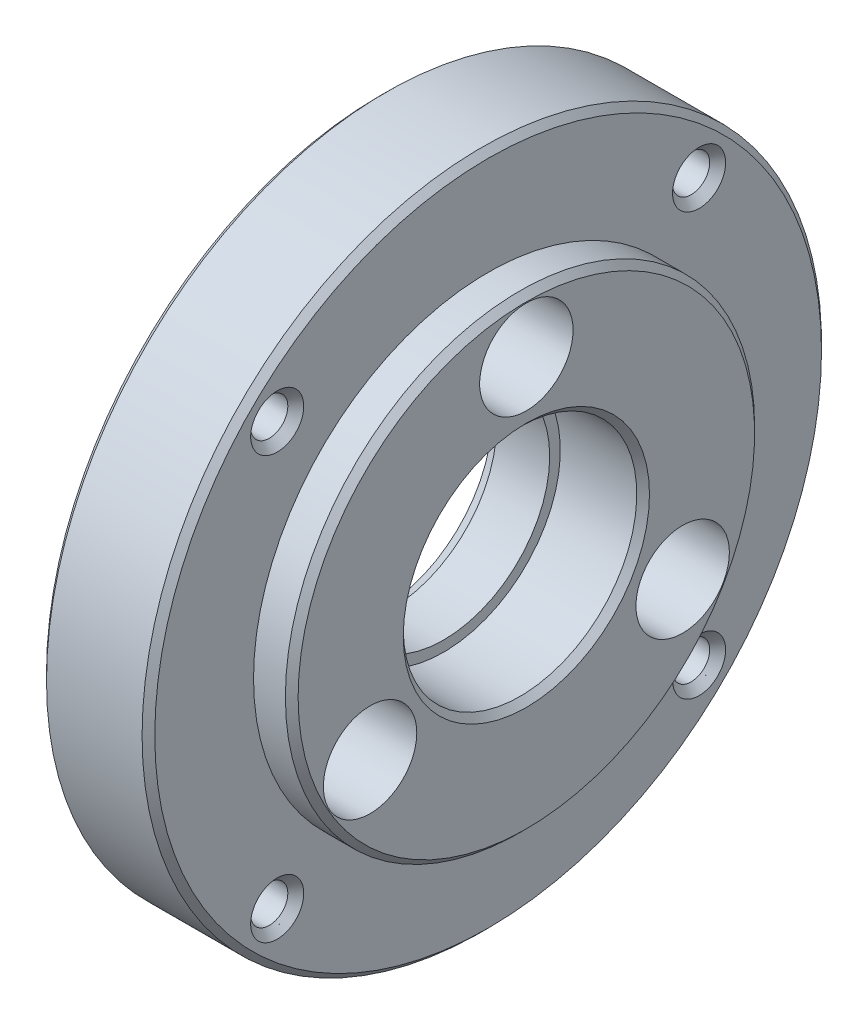
ISO-10303-21;
HEADER;
FILE_DESCRIPTION(('STEP AP214'),'2;1');
FILE_NAME('part.step','',(''),(''),'','','');
FILE_SCHEMA(('AUTOMOTIVE_DESIGN { 1 0 10303 214 1 1 1 1 }'));
ENDSEC;
DATA;
#1=APPLICATION_CONTEXT('core data for automotive mechanical design processes');
#2=APPLICATION_PROTOCOL_DEFINITION('international standard','automotive_design',2000,#1);
#3=PRODUCT_CONTEXT('',#1,'mechanical');
#4=PRODUCT('Part','Part','',(#3));
#5=PRODUCT_RELATED_PRODUCT_CATEGORY('part','',(#4));
#6=PRODUCT_DEFINITION_FORMATION('','',#4);
#7=PRODUCT_DEFINITION_CONTEXT('part definition',#1,'design');
#8=PRODUCT_DEFINITION('design','',#6,#7);
#9=PRODUCT_DEFINITION_SHAPE('','',#8);
#10=(LENGTH_UNIT() NAMED_UNIT(*) SI_UNIT(.MILLI.,.METRE.));
#11=(NAMED_UNIT(*) PLANE_ANGLE_UNIT() SI_UNIT($,.RADIAN.));
#12=(NAMED_UNIT(*) SI_UNIT($,.STERADIAN.) SOLID_ANGLE_UNIT());
#13=UNCERTAINTY_MEASURE_WITH_UNIT(LENGTH_MEASURE(1.E-05),#10,'distance_accuracy_value','');
#14=(GEOMETRIC_REPRESENTATION_CONTEXT(3) GLOBAL_UNCERTAINTY_ASSIGNED_CONTEXT((#13)) GLOBAL_UNIT_ASSIGNED_CONTEXT((#10,
#11,#12)) REPRESENTATION_CONTEXT('',''));
#15=CARTESIAN_POINT('',(0.,0.,0.));
#16=DIRECTION('',(0.,0.,1.));
#17=DIRECTION('',(1.,0.,0.));
#18=AXIS2_PLACEMENT_3D('',#15,#16,#17);
#19=CARTESIAN_POINT('',(1.80000000000291,0.,0.));
#20=DIRECTION('',(1.,0.,0.));
#21=DIRECTION('',(0.,1.,0.));
#22=AXIS2_PLACEMENT_3D('',#19,#20,#21);
#23=CONICAL_SURFACE('',#22,5.79900000002453,0.78539816358756);
#24=CARTESIAN_POINT('',(1.501,0.,0.));
#25=DIRECTION('',(-1.,0.,0.));
#26=DIRECTION('',(0.,0.,1.));
#27=AXIS2_PLACEMENT_3D('',#24,#25,#26);
#28=CIRCLE('',#27,5.5);
#29=CARTESIAN_POINT('',(1.501,0.,5.5));
#30=VERTEX_POINT('',#29);
#31=EDGE_CURVE('P0_E113',#30,#30,#28,.T.);
#32=ORIENTED_EDGE('',*,*,#31,.T.);
#33=EDGE_LOOP('',(#32));
#34=FACE_BOUND('',#33,.T.);
#35=CARTESIAN_POINT('',(1.80000000000291,0.,0.));
#36=DIRECTION('',(1.,0.,0.));
#37=DIRECTION('',(0.,1.,0.));
#38=AXIS2_PLACEMENT_3D('',#35,#36,#37);
#39=CIRCLE('',#38,5.79900000002453);
#40=CARTESIAN_POINT('',(1.80000000000291,5.79900000002453,0.));
#41=VERTEX_POINT('',#40);
#42=EDGE_CURVE('P0_E18',#41,#41,#39,.T.);
#43=ORIENTED_EDGE('',*,*,#42,.T.);
#44=EDGE_LOOP('',(#43));
#45=FACE_BOUND('',#44,.T.);
#46=ADVANCED_FACE('P0_F15',(#34,#45),#23,.F.);
#47=CARTESIAN_POINT('',(1.49999999999798,0.,0.));
#48=DIRECTION('',(-1.,0.,0.));
#49=DIRECTION('',(0.,0.,1.));
#50=AXIS2_PLACEMENT_3D('',#47,#48,#49);
#51=CONICAL_SURFACE('',#50,11.049999999998,0.785398163397301);
#52=CARTESIAN_POINT('',(1.49999999999798,0.,0.));
#53=DIRECTION('',(-1.,0.,0.));
#54=DIRECTION('',(0.,0.,1.));
#55=AXIS2_PLACEMENT_3D('',#52,#53,#54);
#56=CIRCLE('',#55,11.05);
#57=CARTESIAN_POINT('',(1.49999999999798,0.,11.05));
#58=VERTEX_POINT('',#57);
#59=EDGE_CURVE('P0_E30',#58,#58,#56,.T.);
#60=ORIENTED_EDGE('',*,*,#59,.F.);
#61=EDGE_LOOP('',(#60));
#62=FACE_BOUND('',#61,.T.);
#63=CARTESIAN_POINT('',(1.79999999999801,0.,0.));
#64=DIRECTION('',(-1.,0.,0.));
#65=DIRECTION('',(0.,0.,1.));
#66=AXIS2_PLACEMENT_3D('',#63,#64,#65);
#67=CIRCLE('',#66,10.749999999998);
#68=CARTESIAN_POINT('',(1.79999999999801,0.,10.749999999998));
#69=VERTEX_POINT('',#68);
#70=EDGE_CURVE('P0_E108',#69,#69,#67,.T.);
#71=ORIENTED_EDGE('',*,*,#70,.T.);
#72=EDGE_LOOP('',(#71));
#73=FACE_BOUND('',#72,.T.);
#74=ADVANCED_FACE('P0_F428',(#62,#73),#51,.T.);
#75=CARTESIAN_POINT('',(2.145,0.,0.));
#76=DIRECTION('',(-1.,0.,0.));
#77=DIRECTION('',(0.,0.,1.));
#78=AXIS2_PLACEMENT_3D('',#75,#76,#77);
#79=CYLINDRICAL_SURFACE('',#78,11.05);
#80=ORIENTED_EDGE('',*,*,#59,.T.);
#81=EDGE_LOOP('',(#80));
#82=FACE_BOUND('',#81,.T.);
#83=CARTESIAN_POINT('',(0.,0.,0.));
#84=DIRECTION('',(-1.,0.,0.));
#85=DIRECTION('',(0.,0.,1.));
#86=AXIS2_PLACEMENT_3D('',#83,#84,#85);
#87=CIRCLE('',#86,11.05);
#88=CARTESIAN_POINT('',(0.,0.,11.05));
#89=VERTEX_POINT('',#88);
#90=EDGE_CURVE('P0_E106',#89,#89,#87,.F.);
#91=ORIENTED_EDGE('',*,*,#90,.T.);
#92=EDGE_LOOP('',(#91));
#93=FACE_BOUND('',#92,.T.);
#94=ADVANCED_FACE('P0_F420',(#82,#93),#79,.T.);
#95=CARTESIAN_POINT('',(2.145,0.,0.));
#96=DIRECTION('',(-1.,0.,0.));
#97=DIRECTION('',(0.,0.,1.));
#98=AXIS2_PLACEMENT_3D('',#95,#96,#97);
#99=CYLINDRICAL_SURFACE('',#98,5.5);
#100=ORIENTED_EDGE('',*,*,#31,.F.);
#101=EDGE_LOOP('',(#100));
#102=FACE_BOUND('',#101,.T.);
#103=CARTESIAN_POINT('',(-2.1,0.,0.));
#104=DIRECTION('',(-1.,0.,0.));
#105=DIRECTION('',(0.,0.,1.));
#106=AXIS2_PLACEMENT_3D('',#103,#104,#105);
#107=CIRCLE('',#106,5.5);
#108=CARTESIAN_POINT('',(-2.1,0.,5.5));
#109=VERTEX_POINT('',#108);
#110=EDGE_CURVE('P0_E100',#109,#109,#107,.T.);
#111=ORIENTED_EDGE('',*,*,#110,.T.);
#112=EDGE_LOOP('',(#111));
#113=FACE_BOUND('',#112,.T.);
#114=ADVANCED_FACE('P0_F412',(#102,#113),#99,.F.);
#115=CARTESIAN_POINT('',(1.8,0.,0.));
#116=DIRECTION('',(-1.,0.,0.));
#117=DIRECTION('',(0.,0.,1.));
#118=AXIS2_PLACEMENT_3D('',#115,#116,#117);
#119=PLANE('',#118);
#120=ORIENTED_EDGE('',*,*,#70,.F.);
#121=EDGE_LOOP('',(#120));
#122=FACE_BOUND('',#121,.T.);
#123=CARTESIAN_POINT('',(1.8,8.5,0.));
#124=DIRECTION('',(1.,0.,0.));
#125=DIRECTION('',(0.,0.,-1.));
#126=AXIS2_PLACEMENT_3D('',#123,#124,#125);
#127=CIRCLE('',#126,2.2);
#128=CARTESIAN_POINT('',(1.8,8.5,-2.2));
#129=VERTEX_POINT('',#128);
#130=EDGE_CURVE('P0_E94',#129,#129,#127,.F.);
#131=ORIENTED_EDGE('',*,*,#130,.T.);
#132=EDGE_LOOP('',(#131));
#133=FACE_BOUND('',#132,.T.);
#134=CARTESIAN_POINT('',(1.8,-4.25,-7.361215932168));
#135=DIRECTION('',(1.,0.,0.));
#136=DIRECTION('',(0.,0.,-1.));
#137=AXIS2_PLACEMENT_3D('',#134,#135,#136);
#138=CIRCLE('',#137,2.2);
#139=CARTESIAN_POINT('',(1.8,-4.25,-9.561215932168));
#140=VERTEX_POINT('',#139);
#141=EDGE_CURVE('P0_E97',#140,#140,#138,.F.);
#142=ORIENTED_EDGE('',*,*,#141,.T.);
#143=EDGE_LOOP('',(#142));
#144=FACE_BOUND('',#143,.T.);
#145=CARTESIAN_POINT('',(1.8,-4.25,7.361215932168));
#146=DIRECTION('',(1.,0.,0.));
#147=DIRECTION('',(0.,0.,-1.));
#148=AXIS2_PLACEMENT_3D('',#145,#146,#147);
#149=CIRCLE('',#148,2.2);
#150=CARTESIAN_POINT('',(1.8,-4.25,5.161215932168));
#151=VERTEX_POINT('',#150);
#152=EDGE_CURVE('P0_E103',#151,#151,#149,.F.);
#153=ORIENTED_EDGE('',*,*,#152,.T.);
#154=EDGE_LOOP('',(#153));
#155=FACE_BOUND('',#154,.T.);
#156=ORIENTED_EDGE('',*,*,#42,.F.);
#157=EDGE_LOOP('',(#156));
#158=FACE_BOUND('',#157,.T.);
#159=ADVANCED_FACE('P0_F173',(#122,#133,#144,#155,#158),#119,.F.);
#160=CARTESIAN_POINT('',(0.,0.,0.));
#161=DIRECTION('',(-1.,0.,0.));
#162=DIRECTION('',(0.,0.,1.));
#163=AXIS2_PLACEMENT_3D('',#160,#161,#162);
#164=PLANE('',#163);
#165=CARTESIAN_POINT('',(-4.85722573273506E-13,0.,0.));
#166=DIRECTION('',(-1.,0.,0.));
#167=DIRECTION('',(0.,0.,1.));
#168=AXIS2_PLACEMENT_3D('',#165,#166,#167);
#169=CIRCLE('',#168,15.7009999999995);
#170=CARTESIAN_POINT('',(-4.85722573273506E-13,0.,15.7009999999995));
#171=VERTEX_POINT('',#170);
#172=EDGE_CURVE('P0_E79',#171,#171,#169,.T.);
#173=ORIENTED_EDGE('',*,*,#172,.F.);
#174=EDGE_LOOP('',(#173));
#175=FACE_BOUND('',#174,.T.);
#176=ORIENTED_EDGE('',*,*,#90,.F.);
#177=EDGE_LOOP('',(#176));
#178=FACE_BOUND('',#177,.T.);
#179=CARTESIAN_POINT('',(-5.6843418860808E-11,9.934850275671,9.934850275671));
#180=DIRECTION('',(1.,0.,0.));
#181=DIRECTION('',(0.,0.,-1.));
#182=AXIS2_PLACEMENT_3D('',#179,#180,#181);
#183=CIRCLE('',#182,1.24999999997168);
#184=CARTESIAN_POINT('',(-5.6843418860808E-11,9.934850275671,8.68485027569932));
#185=VERTEX_POINT('',#184);
#186=EDGE_CURVE('P0_E82',#185,#185,#183,.F.);
#187=ORIENTED_EDGE('',*,*,#186,.T.);
#188=EDGE_LOOP('',(#187));
#189=FACE_BOUND('',#188,.T.);
#190=CARTESIAN_POINT('',(0.,9.934850275671,-9.934850275671));
#191=DIRECTION('',(1.,0.,0.));
#192=DIRECTION('',(0.,0.,-1.));
#193=AXIS2_PLACEMENT_3D('',#190,#191,#192);
#194=CIRCLE('',#193,1.2499999999692);
#195=CARTESIAN_POINT('',(0.,9.934850275671,-11.1848502756402));
#196=VERTEX_POINT('',#195);
#197=EDGE_CURVE('P0_E85',#196,#196,#194,.F.);
#198=ORIENTED_EDGE('',*,*,#197,.T.);
#199=EDGE_LOOP('',(#198));
#200=FACE_BOUND('',#199,.T.);
#201=CARTESIAN_POINT('',(0.,-9.934850275671,-9.934850275671));
#202=DIRECTION('',(1.,0.,0.));
#203=DIRECTION('',(0.,0.,-1.));
#204=AXIS2_PLACEMENT_3D('',#201,#202,#203);
#205=CIRCLE('',#204,1.2499999999692);
#206=CARTESIAN_POINT('',(0.,-9.934850275671,-11.1848502756402));
#207=VERTEX_POINT('',#206);
#208=EDGE_CURVE('P0_E88',#207,#207,#205,.F.);
#209=ORIENTED_EDGE('',*,*,#208,.T.);
#210=EDGE_LOOP('',(#209));
#211=FACE_BOUND('',#210,.T.);
#212=CARTESIAN_POINT('',(-5.6843418860808E-11,-9.934850275671,9.934850275671));
#213=DIRECTION('',(1.,0.,0.));
#214=DIRECTION('',(0.,0.,-1.));
#215=AXIS2_PLACEMENT_3D('',#212,#213,#214);
#216=CIRCLE('',#215,1.24999999997168);
#217=CARTESIAN_POINT('',(-5.6843418860808E-11,-9.934850275671,8.68485027569932));
#218=VERTEX_POINT('',#217);
#219=EDGE_CURVE('P0_E91',#218,#218,#216,.F.);
#220=ORIENTED_EDGE('',*,*,#219,.T.);
#221=EDGE_LOOP('',(#220));
#222=FACE_BOUND('',#221,.T.);
#223=ADVANCED_FACE('P0_F169',(#175,#178,#189,#200,#211,#222),#164,.F.);
#224=CARTESIAN_POINT('',(-2.6,-4.25,7.361215932168));
#225=DIRECTION('',(1.,0.,0.));
#226=DIRECTION('',(0.,0.,-1.));
#227=AXIS2_PLACEMENT_3D('',#224,#225,#226);
#228=CYLINDRICAL_SURFACE('',#227,2.2);
#229=ORIENTED_EDGE('',*,*,#152,.F.);
#230=EDGE_LOOP('',(#229));
#231=FACE_BOUND('',#230,.T.);
#232=CARTESIAN_POINT('',(-2.6,-4.25,7.361215932168));
#233=DIRECTION('',(1.,0.,0.));
#234=DIRECTION('',(0.,0.,-1.));
#235=AXIS2_PLACEMENT_3D('',#232,#233,#234);
#236=CIRCLE('',#235,2.2);
#237=CARTESIAN_POINT('',(-2.6,-4.25,5.161215932168));
#238=VERTEX_POINT('',#237);
#239=EDGE_CURVE('P0_E76',#238,#238,#236,.T.);
#240=ORIENTED_EDGE('',*,*,#239,.F.);
#241=EDGE_LOOP('',(#240));
#242=FACE_BOUND('',#241,.T.);
#243=ADVANCED_FACE('P0_F172',(#231,#242),#228,.F.);
#244=CARTESIAN_POINT('',(-2.1,0.,0.));
#245=DIRECTION('',(-1.,0.,0.));
#246=DIRECTION('',(0.,0.,1.));
#247=AXIS2_PLACEMENT_3D('',#244,#245,#246);
#248=PLANE('',#247);
#249=ORIENTED_EDGE('',*,*,#110,.F.);
#250=EDGE_LOOP('',(#249));
#251=FACE_BOUND('',#250,.T.);
#252=CARTESIAN_POINT('',(-2.1,0.,0.));
#253=DIRECTION('',(-1.,0.,0.));
#254=DIRECTION('',(0.,0.,1.));
#255=AXIS2_PLACEMENT_3D('',#252,#253,#254);
#256=CIRCLE('',#255,5.);
#257=CARTESIAN_POINT('',(-2.1,0.,5.));
#258=VERTEX_POINT('',#257);
#259=EDGE_CURVE('P0_E73',#258,#258,#256,.T.);
#260=ORIENTED_EDGE('',*,*,#259,.T.);
#261=EDGE_LOOP('',(#260));
#262=FACE_BOUND('',#261,.T.);
#263=ADVANCED_FACE('P0_F386',(#251,#262),#248,.F.);
#264=CARTESIAN_POINT('',(-2.6,-4.25,-7.361215932168));
#265=DIRECTION('',(1.,0.,0.));
#266=DIRECTION('',(0.,0.,-1.));
#267=AXIS2_PLACEMENT_3D('',#264,#265,#266);
#268=CYLINDRICAL_SURFACE('',#267,2.2);
#269=ORIENTED_EDGE('',*,*,#141,.F.);
#270=EDGE_LOOP('',(#269));
#271=FACE_BOUND('',#270,.T.);
#272=CARTESIAN_POINT('',(-2.6,-4.25,-7.361215932168));
#273=DIRECTION('',(1.,0.,0.));
#274=DIRECTION('',(0.,0.,-1.));
#275=AXIS2_PLACEMENT_3D('',#272,#273,#274);
#276=CIRCLE('',#275,2.2);
#277=CARTESIAN_POINT('',(-2.6,-4.25,-9.561215932168));
#278=VERTEX_POINT('',#277);
#279=EDGE_CURVE('P0_E70',#278,#278,#276,.T.);
#280=ORIENTED_EDGE('',*,*,#279,.F.);
#281=EDGE_LOOP('',(#280));
#282=FACE_BOUND('',#281,.T.);
#283=ADVANCED_FACE('P0_F199',(#271,#282),#268,.F.);
#284=CARTESIAN_POINT('',(-2.6,8.5,0.));
#285=DIRECTION('',(1.,0.,0.));
#286=DIRECTION('',(0.,0.,-1.));
#287=AXIS2_PLACEMENT_3D('',#284,#285,#286);
#288=CYLINDRICAL_SURFACE('',#287,2.2);
#289=ORIENTED_EDGE('',*,*,#130,.F.);
#290=EDGE_LOOP('',(#289));
#291=FACE_BOUND('',#290,.T.);
#292=CARTESIAN_POINT('',(-2.6,8.5,0.));
#293=DIRECTION('',(1.,0.,0.));
#294=DIRECTION('',(0.,0.,-1.));
#295=AXIS2_PLACEMENT_3D('',#292,#293,#294);
#296=CIRCLE('',#295,2.2);
#297=CARTESIAN_POINT('',(-2.6,8.5,-2.2));
#298=VERTEX_POINT('',#297);
#299=EDGE_CURVE('P0_E66',#298,#298,#296,.T.);
#300=ORIENTED_EDGE('',*,*,#299,.F.);
#301=EDGE_LOOP('',(#300));
#302=FACE_BOUND('',#301,.T.);
#303=ADVANCED_FACE('P0_F188',(#291,#302),#288,.F.);
#304=CARTESIAN_POINT('',(-5.6843418860808E-11,-9.934850275671,9.934850275671));
#305=DIRECTION('',(1.,0.,0.));
#306=DIRECTION('',(0.,0.,-1.));
#307=AXIS2_PLACEMENT_3D('',#304,#305,#306);
#308=CONICAL_SURFACE('',#307,1.24999999997168,0.785398163549031);
#309=CARTESIAN_POINT('',(-0.375,-9.934850275671,9.934850275671));
#310=DIRECTION('',(1.,0.,0.));
#311=DIRECTION('',(0.,0.,-1.));
#312=AXIS2_PLACEMENT_3D('',#309,#310,#311);
#313=CIRCLE('',#312,0.875000000000001);
#314=CARTESIAN_POINT('',(-0.375,-9.934850275671,9.059850275671));
#315=VERTEX_POINT('',#314);
#316=EDGE_CURVE('P0_E69',#315,#315,#313,.F.);
#317=ORIENTED_EDGE('',*,*,#316,.T.);
#318=EDGE_LOOP('',(#317));
#319=FACE_BOUND('',#318,.T.);
#320=ORIENTED_EDGE('',*,*,#219,.F.);
#321=EDGE_LOOP('',(#320));
#322=FACE_BOUND('',#321,.T.);
#323=ADVANCED_FACE('P0_F185',(#319,#322),#308,.F.);
#324=CARTESIAN_POINT('',(0.,-9.934850275671,-9.934850275671));
#325=DIRECTION('',(1.,0.,0.));
#326=DIRECTION('',(0.,0.,-1.));
#327=AXIS2_PLACEMENT_3D('',#324,#325,#326);
#328=CONICAL_SURFACE('',#327,1.2499999999692,0.785398163397448);
#329=CARTESIAN_POINT('',(-0.375,-9.934850275671,-9.934850275671));
#330=DIRECTION('',(1.,0.,0.));
#331=DIRECTION('',(0.,0.,-1.));
#332=AXIS2_PLACEMENT_3D('',#329,#330,#331);
#333=CIRCLE('',#332,0.875000000000001);
#334=CARTESIAN_POINT('',(-0.375,-9.934850275671,-10.809850275671));
#335=VERTEX_POINT('',#334);
#336=EDGE_CURVE('P0_E123',#335,#335,#333,.F.);
#337=ORIENTED_EDGE('',*,*,#336,.T.);
#338=EDGE_LOOP('',(#337));
#339=FACE_BOUND('',#338,.T.);
#340=ORIENTED_EDGE('',*,*,#208,.F.);
#341=EDGE_LOOP('',(#340));
#342=FACE_BOUND('',#341,.T.);
#343=ADVANCED_FACE('P0_F187',(#339,#342),#328,.F.);
#344=CARTESIAN_POINT('',(0.,9.934850275671,-9.934850275671));
#345=DIRECTION('',(1.,0.,0.));
#346=DIRECTION('',(0.,0.,-1.));
#347=AXIS2_PLACEMENT_3D('',#344,#345,#346);
#348=CONICAL_SURFACE('',#347,1.2499999999692,0.785398163397448);
#349=CARTESIAN_POINT('',(-0.375,9.934850275671,-9.934850275671));
#350=DIRECTION('',(1.,0.,0.));
#351=DIRECTION('',(0.,0.,-1.));
#352=AXIS2_PLACEMENT_3D('',#349,#350,#351);
#353=CIRCLE('',#352,0.875000000000001);
#354=CARTESIAN_POINT('',(-0.375,9.934850275671,-10.809850275671));
#355=VERTEX_POINT('',#354);
#356=EDGE_CURVE('P0_E126',#355,#355,#353,.F.);
#357=ORIENTED_EDGE('',*,*,#356,.T.);
#358=EDGE_LOOP('',(#357));
#359=FACE_BOUND('',#358,.T.);
#360=ORIENTED_EDGE('',*,*,#197,.F.);
#361=EDGE_LOOP('',(#360));
#362=FACE_BOUND('',#361,.T.);
#363=ADVANCED_FACE('P0_F196',(#359,#362),#348,.F.);
#364=CARTESIAN_POINT('',(-5.6843418860808E-11,9.934850275671,9.934850275671));
#365=DIRECTION('',(1.,0.,0.));
#366=DIRECTION('',(0.,0.,-1.));
#367=AXIS2_PLACEMENT_3D('',#364,#365,#366);
#368=CONICAL_SURFACE('',#367,1.24999999997168,0.785398163549031);
#369=CARTESIAN_POINT('',(-0.375,9.934850275671,9.934850275671));
#370=DIRECTION('',(1.,0.,0.));
#371=DIRECTION('',(0.,0.,-1.));
#372=AXIS2_PLACEMENT_3D('',#369,#370,#371);
#373=CIRCLE('',#372,0.875000000000001);
#374=CARTESIAN_POINT('',(-0.375,9.934850275671,9.059850275671));
#375=VERTEX_POINT('',#374);
#376=EDGE_CURVE('P0_E129',#375,#375,#373,.F.);
#377=ORIENTED_EDGE('',*,*,#376,.T.);
#378=EDGE_LOOP('',(#377));
#379=FACE_BOUND('',#378,.T.);
#380=ORIENTED_EDGE('',*,*,#186,.F.);
#381=EDGE_LOOP('',(#380));
#382=FACE_BOUND('',#381,.T.);
#383=ADVANCED_FACE('P0_F165',(#379,#382),#368,.F.);
#384=CARTESIAN_POINT('',(-0.298999999972599,0.,0.));
#385=DIRECTION('',(-1.,0.,0.));
#386=DIRECTION('',(0.,0.,1.));
#387=AXIS2_PLACEMENT_3D('',#384,#385,#386);
#388=CONICAL_SURFACE('',#387,15.9999999999716,0.785398163397301);
#389=CARTESIAN_POINT('',(-0.2989999999726,0.,0.));
#390=DIRECTION('',(-1.,0.,0.));
#391=DIRECTION('',(0.,0.,1.));
#392=AXIS2_PLACEMENT_3D('',#389,#390,#391);
#393=CIRCLE('',#392,16.);
#394=CARTESIAN_POINT('',(-0.2989999999726,0.,16.));
#395=VERTEX_POINT('',#394);
#396=EDGE_CURVE('P0_E65',#395,#395,#393,.T.);
#397=ORIENTED_EDGE('',*,*,#396,.F.);
#398=EDGE_LOOP('',(#397));
#399=FACE_BOUND('',#398,.T.);
#400=ORIENTED_EDGE('',*,*,#172,.T.);
#401=EDGE_LOOP('',(#400));
#402=FACE_BOUND('',#401,.T.);
#403=ADVANCED_FACE('P0_F161',(#399,#402),#388,.T.);
#404=CARTESIAN_POINT('',(-2.6,-4.25,7.361215932168));
#405=DIRECTION('',(1.,0.,0.));
#406=DIRECTION('',(0.,0.,-1.));
#407=AXIS2_PLACEMENT_3D('',#404,#405,#406);
#408=PLANE('',#407);
#409=ORIENTED_EDGE('',*,*,#239,.T.);
#410=EDGE_LOOP('',(#409));
#411=FACE_BOUND('',#410,.T.);
#412=CARTESIAN_POINT('',(-2.6,-4.25,7.361215932168));
#413=DIRECTION('',(1.,0.,0.));
#414=DIRECTION('',(0.,0.,-1.));
#415=AXIS2_PLACEMENT_3D('',#412,#413,#414);
#416=CIRCLE('',#415,1.2);
#417=CARTESIAN_POINT('',(-2.6,-4.25,6.161215932168));
#418=VERTEX_POINT('',#417);
#419=EDGE_CURVE('P0_E62',#418,#418,#416,.F.);
#420=ORIENTED_EDGE('',*,*,#419,.T.);
#421=EDGE_LOOP('',(#420));
#422=FACE_BOUND('',#421,.T.);
#423=ADVANCED_FACE('P0_F164',(#411,#422),#408,.T.);
#424=CARTESIAN_POINT('',(2.145,0.,0.));
#425=DIRECTION('',(-1.,0.,0.));
#426=DIRECTION('',(0.,0.,1.));
#427=AXIS2_PLACEMENT_3D('',#424,#425,#426);
#428=CYLINDRICAL_SURFACE('',#427,5.);
#429=ORIENTED_EDGE('',*,*,#259,.F.);
#430=EDGE_LOOP('',(#429));
#431=FACE_BOUND('',#430,.T.);
#432=CARTESIAN_POINT('',(-4.59999999998217,0.,0.));
#433=DIRECTION('',(-1.,0.,0.));
#434=DIRECTION('',(0.,0.,1.));
#435=AXIS2_PLACEMENT_3D('',#432,#433,#434);
#436=CIRCLE('',#435,4.99999999999545);
#437=CARTESIAN_POINT('',(-4.59999999998217,0.,4.99999999999545));
#438=VERTEX_POINT('',#437);
#439=EDGE_CURVE('P0_E61',#438,#438,#436,.T.);
#440=ORIENTED_EDGE('',*,*,#439,.T.);
#441=EDGE_LOOP('',(#440));
#442=FACE_BOUND('',#441,.T.);
#443=ADVANCED_FACE('P0_F264',(#431,#442),#428,.F.);
#444=CARTESIAN_POINT('',(-2.6,-4.25,-7.361215932168));
#445=DIRECTION('',(1.,0.,0.));
#446=DIRECTION('',(0.,0.,-1.));
#447=AXIS2_PLACEMENT_3D('',#444,#445,#446);
#448=PLANE('',#447);
#449=ORIENTED_EDGE('',*,*,#279,.T.);
#450=EDGE_LOOP('',(#449));
#451=FACE_BOUND('',#450,.T.);
#452=CARTESIAN_POINT('',(-2.6,-4.25,-7.361215932168));
#453=DIRECTION('',(1.,0.,0.));
#454=DIRECTION('',(0.,0.,-1.));
#455=AXIS2_PLACEMENT_3D('',#452,#453,#454);
#456=CIRCLE('',#455,1.2);
#457=CARTESIAN_POINT('',(-2.6,-4.25,-8.561215932168));
#458=VERTEX_POINT('',#457);
#459=EDGE_CURVE('P0_E58',#458,#458,#456,.F.);
#460=ORIENTED_EDGE('',*,*,#459,.T.);
#461=EDGE_LOOP('',(#460));
#462=FACE_BOUND('',#461,.T.);
#463=ADVANCED_FACE('P0_F260',(#451,#462),#448,.T.);
#464=CARTESIAN_POINT('',(-2.6,8.5,0.));
#465=DIRECTION('',(1.,0.,0.));
#466=DIRECTION('',(0.,0.,-1.));
#467=AXIS2_PLACEMENT_3D('',#464,#465,#466);
#468=PLANE('',#467);
#469=ORIENTED_EDGE('',*,*,#299,.T.);
#470=EDGE_LOOP('',(#469));
#471=FACE_BOUND('',#470,.T.);
#472=CARTESIAN_POINT('',(-2.6,8.5,0.));
#473=DIRECTION('',(1.,0.,0.));
#474=DIRECTION('',(0.,0.,-1.));
#475=AXIS2_PLACEMENT_3D('',#472,#473,#474);
#476=CIRCLE('',#475,1.2);
#477=CARTESIAN_POINT('',(-2.6,8.5,-1.2));
#478=VERTEX_POINT('',#477);
#479=EDGE_CURVE('P0_E54',#478,#478,#476,.F.);
#480=ORIENTED_EDGE('',*,*,#479,.T.);
#481=EDGE_LOOP('',(#480));
#482=FACE_BOUND('',#481,.T.);
#483=ADVANCED_FACE('P0_F256',(#471,#482),#468,.T.);
#484=CARTESIAN_POINT('',(-5.355,-9.934850275671,9.934850275671));
#485=DIRECTION('',(1.,0.,0.));
#486=DIRECTION('',(0.,0.,-1.));
#487=AXIS2_PLACEMENT_3D('',#484,#485,#486);
#488=CYLINDRICAL_SURFACE('',#487,0.875000000000001);
#489=CARTESIAN_POINT('',(-4.72499999989395,-9.934850275671,9.934850275671));
#490=DIRECTION('',(-1.,0.,0.));
#491=DIRECTION('',(0.,0.,1.));
#492=AXIS2_PLACEMENT_3D('',#489,#490,#491);
#493=CIRCLE('',#492,0.874999999949647);
#494=CARTESIAN_POINT('',(-4.72499999989395,-9.934850275671,10.8098502756206));
#495=VERTEX_POINT('',#494);
#496=EDGE_CURVE('P0_E57',#495,#495,#493,.T.);
#497=ORIENTED_EDGE('',*,*,#496,.T.);
#498=EDGE_LOOP('',(#497));
#499=FACE_BOUND('',#498,.T.);
#500=ORIENTED_EDGE('',*,*,#316,.F.);
#501=EDGE_LOOP('',(#500));
#502=FACE_BOUND('',#501,.T.);
#503=ADVANCED_FACE('P0_F252',(#499,#502),#488,.F.);
#504=CARTESIAN_POINT('',(-5.355,-9.934850275671,-9.934850275671));
#505=DIRECTION('',(1.,0.,0.));
#506=DIRECTION('',(0.,0.,-1.));
#507=AXIS2_PLACEMENT_3D('',#504,#505,#506);
#508=CYLINDRICAL_SURFACE('',#507,0.875000000000001);
#509=CARTESIAN_POINT('',(-4.7249999999508,-9.934850275671,-9.934850275671));
#510=DIRECTION('',(-1.,0.,0.));
#511=DIRECTION('',(0.,0.,1.));
#512=AXIS2_PLACEMENT_3D('',#509,#510,#511);
#513=CIRCLE('',#512,0.875000000008971);
#514=CARTESIAN_POINT('',(-4.7249999999508,-9.934850275671,-9.05985027566203));
#515=VERTEX_POINT('',#514);
#516=EDGE_CURVE('P0_E138',#515,#515,#513,.T.);
#517=ORIENTED_EDGE('',*,*,#516,.T.);
#518=EDGE_LOOP('',(#517));
#519=FACE_BOUND('',#518,.T.);
#520=ORIENTED_EDGE('',*,*,#336,.F.);
#521=EDGE_LOOP('',(#520));
#522=FACE_BOUND('',#521,.T.);
#523=ADVANCED_FACE('P0_F248',(#519,#522),#508,.F.);
#524=CARTESIAN_POINT('',(-5.355,9.934850275671,-9.934850275671));
#525=DIRECTION('',(1.,0.,0.));
#526=DIRECTION('',(0.,0.,-1.));
#527=AXIS2_PLACEMENT_3D('',#524,#525,#526);
#528=CYLINDRICAL_SURFACE('',#527,0.875000000000001);
#529=CARTESIAN_POINT('',(-4.7249999999508,9.934850275671,-9.934850275671));
#530=DIRECTION('',(-1.,0.,0.));
#531=DIRECTION('',(0.,0.,1.));
#532=AXIS2_PLACEMENT_3D('',#529,#530,#531);
#533=CIRCLE('',#532,0.875000000008971);
#534=CARTESIAN_POINT('',(-4.7249999999508,9.934850275671,-9.05985027566203));
#535=VERTEX_POINT('',#534);
#536=EDGE_CURVE('P0_E141',#535,#535,#533,.T.);
#537=ORIENTED_EDGE('',*,*,#536,.T.);
#538=EDGE_LOOP('',(#537));
#539=FACE_BOUND('',#538,.T.);
#540=ORIENTED_EDGE('',*,*,#356,.F.);
#541=EDGE_LOOP('',(#540));
#542=FACE_BOUND('',#541,.T.);
#543=ADVANCED_FACE('P0_F244',(#539,#542),#528,.F.);
#544=CARTESIAN_POINT('',(-5.355,9.934850275671,9.934850275671));
#545=DIRECTION('',(1.,0.,0.));
#546=DIRECTION('',(0.,0.,-1.));
#547=AXIS2_PLACEMENT_3D('',#544,#545,#546);
#548=CYLINDRICAL_SURFACE('',#547,0.875000000000001);
#549=CARTESIAN_POINT('',(-4.72499999989395,9.934850275671,9.934850275671));
#550=DIRECTION('',(-1.,0.,0.));
#551=DIRECTION('',(0.,0.,1.));
#552=AXIS2_PLACEMENT_3D('',#549,#550,#551);
#553=CIRCLE('',#552,0.874999999949647);
#554=CARTESIAN_POINT('',(-4.72499999989395,9.934850275671,10.8098502756206));
#555=VERTEX_POINT('',#554);
#556=EDGE_CURVE('P0_E144',#555,#555,#553,.T.);
#557=ORIENTED_EDGE('',*,*,#556,.T.);
#558=EDGE_LOOP('',(#557));
#559=FACE_BOUND('',#558,.T.);
#560=ORIENTED_EDGE('',*,*,#376,.F.);
#561=EDGE_LOOP('',(#560));
#562=FACE_BOUND('',#561,.T.);
#563=ADVANCED_FACE('P0_F157',(#559,#562),#548,.F.);
#564=CARTESIAN_POINT('',(2.145,0.,0.));
#565=DIRECTION('',(-1.,0.,0.));
#566=DIRECTION('',(0.,0.,1.));
#567=AXIS2_PLACEMENT_3D('',#564,#565,#566);
#568=CYLINDRICAL_SURFACE('',#567,16.);
#569=CARTESIAN_POINT('',(-4.8010000000005,0.,0.));
#570=DIRECTION('',(1.,0.,0.));
#571=DIRECTION('',(0.,0.,-1.));
#572=AXIS2_PLACEMENT_3D('',#569,#570,#571);
#573=CIRCLE('',#572,16.0000000000005);
#574=CARTESIAN_POINT('',(-4.8010000000005,0.,-16.0000000000005));
#575=VERTEX_POINT('',#574);
#576=EDGE_CURVE('P0_E53',#575,#575,#573,.F.);
#577=ORIENTED_EDGE('',*,*,#576,.F.);
#578=EDGE_LOOP('',(#577));
#579=FACE_BOUND('',#578,.T.);
#580=ORIENTED_EDGE('',*,*,#396,.T.);
#581=EDGE_LOOP('',(#580));
#582=FACE_BOUND('',#581,.T.);
#583=ADVANCED_FACE('P0_F153',(#579,#582),#568,.T.);
#584=CARTESIAN_POINT('',(-5.1,-4.25,7.361215932168));
#585=DIRECTION('',(1.,0.,0.));
#586=DIRECTION('',(0.,0.,-1.));
#587=AXIS2_PLACEMENT_3D('',#584,#585,#586);
#588=CYLINDRICAL_SURFACE('',#587,1.2);
#589=ORIENTED_EDGE('',*,*,#419,.F.);
#590=EDGE_LOOP('',(#589));
#591=FACE_BOUND('',#590,.T.);
#592=CARTESIAN_POINT('',(-5.1,-4.25,7.361215932168));
#593=DIRECTION('',(1.,0.,0.));
#594=DIRECTION('',(0.,0.,-1.));
#595=AXIS2_PLACEMENT_3D('',#592,#593,#594);
#596=CIRCLE('',#595,1.2);
#597=CARTESIAN_POINT('',(-5.1,-4.25,6.161215932168));
#598=VERTEX_POINT('',#597);
#599=EDGE_CURVE('P0_E50',#598,#598,#596,.T.);
#600=ORIENTED_EDGE('',*,*,#599,.F.);
#601=EDGE_LOOP('',(#600));
#602=FACE_BOUND('',#601,.T.);
#603=ADVANCED_FACE('P0_F156',(#591,#602),#588,.F.);
#604=CARTESIAN_POINT('',(-5.09999999997035,0.,0.));
#605=DIRECTION('',(-1.,0.,0.));
#606=DIRECTION('',(0.,0.,1.));
#607=AXIS2_PLACEMENT_3D('',#604,#605,#606);
#608=CONICAL_SURFACE('',#607,5.28867513457953,0.523598775592442);
#609=ORIENTED_EDGE('',*,*,#439,.F.);
#610=EDGE_LOOP('',(#609));
#611=FACE_BOUND('',#610,.T.);
#612=CARTESIAN_POINT('',(-5.09999999997035,0.,0.));
#613=DIRECTION('',(-1.,0.,0.));
#614=DIRECTION('',(0.,0.,1.));
#615=AXIS2_PLACEMENT_3D('',#612,#613,#614);
#616=CIRCLE('',#615,5.28867513457953);
#617=CARTESIAN_POINT('',(-5.09999999997035,0.,5.28867513457953));
#618=VERTEX_POINT('',#617);
#619=EDGE_CURVE('P0_E47',#618,#618,#616,.F.);
#620=ORIENTED_EDGE('',*,*,#619,.F.);
#621=EDGE_LOOP('',(#620));
#622=FACE_BOUND('',#621,.T.);
#623=ADVANCED_FACE('P0_F234',(#611,#622),#608,.F.);
#624=CARTESIAN_POINT('',(-5.1,-4.25,-7.361215932168));
#625=DIRECTION('',(1.,0.,0.));
#626=DIRECTION('',(0.,0.,-1.));
#627=AXIS2_PLACEMENT_3D('',#624,#625,#626);
#628=CYLINDRICAL_SURFACE('',#627,1.2);
#629=ORIENTED_EDGE('',*,*,#459,.F.);
#630=EDGE_LOOP('',(#629));
#631=FACE_BOUND('',#630,.T.);
#632=CARTESIAN_POINT('',(-5.1,-4.25,-7.361215932168));
#633=DIRECTION('',(1.,0.,0.));
#634=DIRECTION('',(0.,0.,-1.));
#635=AXIS2_PLACEMENT_3D('',#632,#633,#634);
#636=CIRCLE('',#635,1.2);
#637=CARTESIAN_POINT('',(-5.1,-4.25,-8.561215932168));
#638=VERTEX_POINT('',#637);
#639=EDGE_CURVE('P0_E44',#638,#638,#636,.T.);
#640=ORIENTED_EDGE('',*,*,#639,.F.);
#641=EDGE_LOOP('',(#640));
#642=FACE_BOUND('',#641,.T.);
#643=ADVANCED_FACE('P0_F230',(#631,#642),#628,.F.);
#644=CARTESIAN_POINT('',(-5.1,8.5,0.));
#645=DIRECTION('',(1.,0.,0.));
#646=DIRECTION('',(0.,0.,-1.));
#647=AXIS2_PLACEMENT_3D('',#644,#645,#646);
#648=CYLINDRICAL_SURFACE('',#647,1.2);
#649=ORIENTED_EDGE('',*,*,#479,.F.);
#650=EDGE_LOOP('',(#649));
#651=FACE_BOUND('',#650,.T.);
#652=CARTESIAN_POINT('',(-5.1,8.5,0.));
#653=DIRECTION('',(1.,0.,0.));
#654=DIRECTION('',(0.,0.,-1.));
#655=AXIS2_PLACEMENT_3D('',#652,#653,#654);
#656=CIRCLE('',#655,1.2);
#657=CARTESIAN_POINT('',(-5.1,8.5,-1.2));
#658=VERTEX_POINT('',#657);
#659=EDGE_CURVE('P0_E41',#658,#658,#656,.T.);
#660=ORIENTED_EDGE('',*,*,#659,.F.);
#661=EDGE_LOOP('',(#660));
#662=FACE_BOUND('',#661,.T.);
#663=ADVANCED_FACE('P0_F226',(#651,#662),#648,.F.);
#664=CARTESIAN_POINT('',(-5.09999999991351,-9.934850275671,9.934850275671));
#665=DIRECTION('',(-1.,0.,0.));
#666=DIRECTION('',(0.,0.,1.));
#667=AXIS2_PLACEMENT_3D('',#664,#665,#666);
#668=CONICAL_SURFACE('',#667,1.2499999999692,0.785398163397448);
#669=ORIENTED_EDGE('',*,*,#496,.F.);
#670=EDGE_LOOP('',(#669));
#671=FACE_BOUND('',#670,.T.);
#672=CARTESIAN_POINT('',(-5.09999999997035,-9.934850275671,9.934850275671));
#673=DIRECTION('',(-1.,0.,0.));
#674=DIRECTION('',(0.,0.,1.));
#675=AXIS2_PLACEMENT_3D('',#672,#673,#674);
#676=CIRCLE('',#675,1.25000000002604);
#677=CARTESIAN_POINT('',(-5.09999999997035,-9.934850275671,11.184850275697));
#678=VERTEX_POINT('',#677);
#679=EDGE_CURVE('P0_E38',#678,#678,#676,.F.);
#680=ORIENTED_EDGE('',*,*,#679,.F.);
#681=EDGE_LOOP('',(#680));
#682=FACE_BOUND('',#681,.T.);
#683=ADVANCED_FACE('P0_F222',(#671,#682),#668,.F.);
#684=CARTESIAN_POINT('',(-5.09999999985666,-9.934850275671,-9.934850275671));
#685=DIRECTION('',(-1.,0.,0.));
#686=DIRECTION('',(0.,0.,1.));
#687=AXIS2_PLACEMENT_3D('',#684,#685,#686);
#688=CONICAL_SURFACE('',#687,1.24999999991484,0.785398163397448);
#689=ORIENTED_EDGE('',*,*,#516,.F.);
#690=EDGE_LOOP('',(#689));
#691=FACE_BOUND('',#690,.T.);
#692=CARTESIAN_POINT('',(-5.09999999991351,-9.934850275671,-9.934850275671));
#693=DIRECTION('',(-1.,0.,0.));
#694=DIRECTION('',(0.,0.,1.));
#695=AXIS2_PLACEMENT_3D('',#692,#693,#694);
#696=CIRCLE('',#695,1.24999999997168);
#697=CARTESIAN_POINT('',(-5.09999999991351,-9.934850275671,-8.68485027569932));
#698=VERTEX_POINT('',#697);
#699=EDGE_CURVE('P0_E35',#698,#698,#696,.F.);
#700=ORIENTED_EDGE('',*,*,#699,.F.);
#701=EDGE_LOOP('',(#700));
#702=FACE_BOUND('',#701,.T.);
#703=ADVANCED_FACE('P0_F218',(#691,#702),#688,.F.);
#704=CARTESIAN_POINT('',(-5.09999999985666,9.934850275671,-9.934850275671));
#705=DIRECTION('',(-1.,0.,0.));
#706=DIRECTION('',(0.,0.,1.));
#707=AXIS2_PLACEMENT_3D('',#704,#705,#706);
#708=CONICAL_SURFACE('',#707,1.24999999991484,0.785398163397448);
#709=ORIENTED_EDGE('',*,*,#536,.F.);
#710=EDGE_LOOP('',(#709));
#711=FACE_BOUND('',#710,.T.);
#712=CARTESIAN_POINT('',(-5.09999999991351,9.934850275671,-9.934850275671));
#713=DIRECTION('',(-1.,0.,0.));
#714=DIRECTION('',(0.,0.,1.));
#715=AXIS2_PLACEMENT_3D('',#712,#713,#714);
#716=CIRCLE('',#715,1.24999999997168);
#717=CARTESIAN_POINT('',(-5.09999999991351,9.934850275671,-8.68485027569932));
#718=VERTEX_POINT('',#717);
#719=EDGE_CURVE('P0_E27',#718,#718,#716,.F.);
#720=ORIENTED_EDGE('',*,*,#719,.F.);
#721=EDGE_LOOP('',(#720));
#722=FACE_BOUND('',#721,.T.);
#723=ADVANCED_FACE('P0_F214',(#711,#722),#708,.F.);
#724=CARTESIAN_POINT('',(-5.09999999991351,9.934850275671,9.934850275671));
#725=DIRECTION('',(-1.,0.,0.));
#726=DIRECTION('',(0.,0.,1.));
#727=AXIS2_PLACEMENT_3D('',#724,#725,#726);
#728=CONICAL_SURFACE('',#727,1.2499999999692,0.785398163397448);
#729=ORIENTED_EDGE('',*,*,#556,.F.);
#730=EDGE_LOOP('',(#729));
#731=FACE_BOUND('',#730,.T.);
#732=CARTESIAN_POINT('',(-5.09999999997035,9.934850275671,9.934850275671));
#733=DIRECTION('',(-1.,0.,0.));
#734=DIRECTION('',(0.,0.,1.));
#735=AXIS2_PLACEMENT_3D('',#732,#733,#734);
#736=CIRCLE('',#735,1.25000000002604);
#737=CARTESIAN_POINT('',(-5.09999999997035,9.934850275671,11.184850275697));
#738=VERTEX_POINT('',#737);
#739=EDGE_CURVE('P0_E22',#738,#738,#736,.F.);
#740=ORIENTED_EDGE('',*,*,#739,.F.);
#741=EDGE_LOOP('',(#740));
#742=FACE_BOUND('',#741,.T.);
#743=ADVANCED_FACE('P0_F208',(#731,#742),#728,.F.);
#744=CARTESIAN_POINT('',(-4.8010000000005,0.,0.));
#745=DIRECTION('',(1.,0.,0.));
#746=DIRECTION('',(0.,0.,-1.));
#747=AXIS2_PLACEMENT_3D('',#744,#745,#746);
#748=CONICAL_SURFACE('',#747,16.0000000000005,0.785398163397299);
#749=ORIENTED_EDGE('',*,*,#576,.T.);
#750=EDGE_LOOP('',(#749));
#751=FACE_BOUND('',#750,.T.);
#752=CARTESIAN_POINT('',(-5.10000000000053,0.,0.));
#753=DIRECTION('',(1.,0.,0.));
#754=DIRECTION('',(0.,0.,-1.));
#755=AXIS2_PLACEMENT_3D('',#752,#753,#754);
#756=CIRCLE('',#755,15.7010000000005);
#757=CARTESIAN_POINT('',(-5.10000000000053,0.,-15.7010000000005));
#758=VERTEX_POINT('',#757);
#759=EDGE_CURVE('P0_E10',#758,#758,#756,.F.);
#760=ORIENTED_EDGE('',*,*,#759,.F.);
#761=EDGE_LOOP('',(#760));
#762=FACE_BOUND('',#761,.T.);
#763=ADVANCED_FACE('P0_F150',(#751,#762),#748,.T.);
#764=CARTESIAN_POINT('',(-5.1,0.,0.));
#765=DIRECTION('',(-1.,0.,0.));
#766=DIRECTION('',(0.,0.,1.));
#767=AXIS2_PLACEMENT_3D('',#764,#765,#766);
#768=PLANE('',#767);
#769=ORIENTED_EDGE('',*,*,#759,.T.);
#770=EDGE_LOOP('',(#769));
#771=FACE_BOUND('',#770,.T.);
#772=ORIENTED_EDGE('',*,*,#739,.T.);
#773=EDGE_LOOP('',(#772));
#774=FACE_BOUND('',#773,.T.);
#775=ORIENTED_EDGE('',*,*,#719,.T.);
#776=EDGE_LOOP('',(#775));
#777=FACE_BOUND('',#776,.T.);
#778=ORIENTED_EDGE('',*,*,#699,.T.);
#779=EDGE_LOOP('',(#778));
#780=FACE_BOUND('',#779,.T.);
#781=ORIENTED_EDGE('',*,*,#679,.T.);
#782=EDGE_LOOP('',(#781));
#783=FACE_BOUND('',#782,.T.);
#784=ORIENTED_EDGE('',*,*,#659,.T.);
#785=EDGE_LOOP('',(#784));
#786=FACE_BOUND('',#785,.T.);
#787=ORIENTED_EDGE('',*,*,#639,.T.);
#788=EDGE_LOOP('',(#787));
#789=FACE_BOUND('',#788,.T.);
#790=ORIENTED_EDGE('',*,*,#619,.T.);
#791=EDGE_LOOP('',(#790));
#792=FACE_BOUND('',#791,.T.);
#793=ORIENTED_EDGE('',*,*,#599,.T.);
#794=EDGE_LOOP('',(#793));
#795=FACE_BOUND('',#794,.T.);
#796=ADVANCED_FACE('P0_F202',(#771,#774,#777,#780,#783,#786,#789,#792,#795),#768,.T.);
#797=CLOSED_SHELL('',(#46,#74,#94,#114,#159,#223,#243,#263,#283,#303,#323,#343,#363,#383,#403,
#423,#443,#463,#483,#503,#523,#543,#563,#583,#603,#623,#643,#663,#683,#703,#723,#743,#763,#796));
#798=MANIFOLD_SOLID_BREP('P0_B1',#797);
#799=CARTESIAN_POINT('',(-5.355,9.934850275671,9.934850275671));
#800=DIRECTION('',(1.,0.,0.));
#801=DIRECTION('',(0.,0.,-1.));
#802=AXIS2_PLACEMENT_3D('',#799,#800,#801);
#803=CYLINDRICAL_SURFACE('',#802,0.999999999999999);
#804=CARTESIAN_POINT('',(-0.25,9.934850275671,9.934850275671));
#805=DIRECTION('',(1.,0.,0.));
#806=DIRECTION('',(0.,0.,-1.));
#807=AXIS2_PLACEMENT_3D('',#804,#805,#806);
#808=CIRCLE('',#807,0.999999999999999);
#809=CARTESIAN_POINT('',(-0.25,9.934850275671,8.934850275671));
#810=VERTEX_POINT('',#809);
#811=EDGE_CURVE('P1_E10',#810,#810,#808,.F.);
#812=ORIENTED_EDGE('',*,*,#811,.T.);
#813=EDGE_LOOP('',(#812));
#814=FACE_BOUND('',#813,.T.);
#815=CARTESIAN_POINT('',(-4.85,9.934850275671,9.934850275671));
#816=DIRECTION('',(1.,0.,0.));
#817=DIRECTION('',(0.,0.,-1.));
#818=AXIS2_PLACEMENT_3D('',#815,#816,#817);
#819=CIRCLE('',#818,0.999999999999999);
#820=CARTESIAN_POINT('',(-4.85,9.934850275671,8.934850275671));
#821=VERTEX_POINT('',#820);
#822=EDGE_CURVE('P1_E16',#821,#821,#819,.T.);
#823=ORIENTED_EDGE('',*,*,#822,.T.);
#824=EDGE_LOOP('',(#823));
#825=FACE_BOUND('',#824,.T.);
#826=ADVANCED_FACE('P1_F15',(#814,#825),#803,.T.);
#827=OPEN_SHELL('',(#826));
#828=SHELL_BASED_SURFACE_MODEL('P1_B1',(#827));
#829=CARTESIAN_POINT('',(-5.355,9.934850275671,-9.934850275671));
#830=DIRECTION('',(1.,0.,0.));
#831=DIRECTION('',(0.,0.,-1.));
#832=AXIS2_PLACEMENT_3D('',#829,#830,#831);
#833=CYLINDRICAL_SURFACE('',#832,0.999999999999999);
#834=CARTESIAN_POINT('',(-0.25,9.934850275671,-9.934850275671));
#835=DIRECTION('',(1.,0.,0.));
#836=DIRECTION('',(0.,0.,-1.));
#837=AXIS2_PLACEMENT_3D('',#834,#835,#836);
#838=CIRCLE('',#837,0.999999999999999);
#839=CARTESIAN_POINT('',(-0.25,9.934850275671,-10.934850275671));
#840=VERTEX_POINT('',#839);
#841=EDGE_CURVE('P2_E10',#840,#840,#838,.F.);
#842=ORIENTED_EDGE('',*,*,#841,.T.);
#843=EDGE_LOOP('',(#842));
#844=FACE_BOUND('',#843,.T.);
#845=CARTESIAN_POINT('',(-4.85,9.934850275671,-9.934850275671));
#846=DIRECTION('',(1.,0.,0.));
#847=DIRECTION('',(0.,0.,-1.));
#848=AXIS2_PLACEMENT_3D('',#845,#846,#847);
#849=CIRCLE('',#848,0.999999999999999);
#850=CARTESIAN_POINT('',(-4.85,9.934850275671,-10.934850275671));
#851=VERTEX_POINT('',#850);
#852=EDGE_CURVE('P2_E16',#851,#851,#849,.T.);
#853=ORIENTED_EDGE('',*,*,#852,.T.);
#854=EDGE_LOOP('',(#853));
#855=FACE_BOUND('',#854,.T.);
#856=ADVANCED_FACE('P2_F15',(#844,#855),#833,.T.);
#857=OPEN_SHELL('',(#856));
#858=SHELL_BASED_SURFACE_MODEL('P2_B1',(#857));
#859=CARTESIAN_POINT('',(-5.355,-9.934850275671,-9.934850275671));
#860=DIRECTION('',(1.,0.,0.));
#861=DIRECTION('',(0.,0.,-1.));
#862=AXIS2_PLACEMENT_3D('',#859,#860,#861);
#863=CYLINDRICAL_SURFACE('',#862,0.999999999999999);
#864=CARTESIAN_POINT('',(-0.25,-9.934850275671,-9.934850275671));
#865=DIRECTION('',(1.,0.,0.));
#866=DIRECTION('',(0.,0.,-1.));
#867=AXIS2_PLACEMENT_3D('',#864,#865,#866);
#868=CIRCLE('',#867,0.999999999999999);
#869=CARTESIAN_POINT('',(-0.25,-9.934850275671,-10.934850275671));
#870=VERTEX_POINT('',#869);
#871=EDGE_CURVE('P3_E10',#870,#870,#868,.F.);
#872=ORIENTED_EDGE('',*,*,#871,.T.);
#873=EDGE_LOOP('',(#872));
#874=FACE_BOUND('',#873,.T.);
#875=CARTESIAN_POINT('',(-4.85,-9.934850275671,-9.934850275671));
#876=DIRECTION('',(1.,0.,0.));
#877=DIRECTION('',(0.,0.,-1.));
#878=AXIS2_PLACEMENT_3D('',#875,#876,#877);
#879=CIRCLE('',#878,0.999999999999999);
#880=CARTESIAN_POINT('',(-4.85,-9.934850275671,-10.934850275671));
#881=VERTEX_POINT('',#880);
#882=EDGE_CURVE('P3_E16',#881,#881,#879,.T.);
#883=ORIENTED_EDGE('',*,*,#882,.T.);
#884=EDGE_LOOP('',(#883));
#885=FACE_BOUND('',#884,.T.);
#886=ADVANCED_FACE('P3_F15',(#874,#885),#863,.T.);
#887=OPEN_SHELL('',(#886));
#888=SHELL_BASED_SURFACE_MODEL('P3_B1',(#887));
#889=CARTESIAN_POINT('',(-5.355,-9.934850275671,9.934850275671));
#890=DIRECTION('',(1.,0.,0.));
#891=DIRECTION('',(0.,0.,-1.));
#892=AXIS2_PLACEMENT_3D('',#889,#890,#891);
#893=CYLINDRICAL_SURFACE('',#892,0.999999999999999);
#894=CARTESIAN_POINT('',(-0.25,-9.934850275671,9.934850275671));
#895=DIRECTION('',(1.,0.,0.));
#896=DIRECTION('',(0.,0.,-1.));
#897=AXIS2_PLACEMENT_3D('',#894,#895,#896);
#898=CIRCLE('',#897,0.999999999999999);
#899=CARTESIAN_POINT('',(-0.25,-9.934850275671,8.934850275671));
#900=VERTEX_POINT('',#899);
#901=EDGE_CURVE('P4_E10',#900,#900,#898,.F.);
#902=ORIENTED_EDGE('',*,*,#901,.T.);
#903=EDGE_LOOP('',(#902));
#904=FACE_BOUND('',#903,.T.);
#905=CARTESIAN_POINT('',(-4.85,-9.934850275671,9.934850275671));
#906=DIRECTION('',(1.,0.,0.));
#907=DIRECTION('',(0.,0.,-1.));
#908=AXIS2_PLACEMENT_3D('',#905,#906,#907);
#909=CIRCLE('',#908,0.999999999999999);
#910=CARTESIAN_POINT('',(-4.85,-9.934850275671,8.934850275671));
#911=VERTEX_POINT('',#910);
#912=EDGE_CURVE('P4_E16',#911,#911,#909,.T.);
#913=ORIENTED_EDGE('',*,*,#912,.T.);
#914=EDGE_LOOP('',(#913));
#915=FACE_BOUND('',#914,.T.);
#916=ADVANCED_FACE('P4_F15',(#904,#915),#893,.T.);
#917=OPEN_SHELL('',(#916));
#918=SHELL_BASED_SURFACE_MODEL('P4_B1',(#917));
#919=ADVANCED_BREP_SHAPE_REPRESENTATION('',(#18,#798),#14);
#920=MANIFOLD_SURFACE_SHAPE_REPRESENTATION('',(#18,#828,#858,#888,#918),#14);
#921=SHAPE_REPRESENTATION('',(#18),#14);
#922=SHAPE_DEFINITION_REPRESENTATION(#9,#921);
#923=SHAPE_REPRESENTATION_RELATIONSHIP('','',#921,#919);
#924=SHAPE_REPRESENTATION_RELATIONSHIP('','',#921,#920);
ENDSEC;
END-ISO-10303-21;
